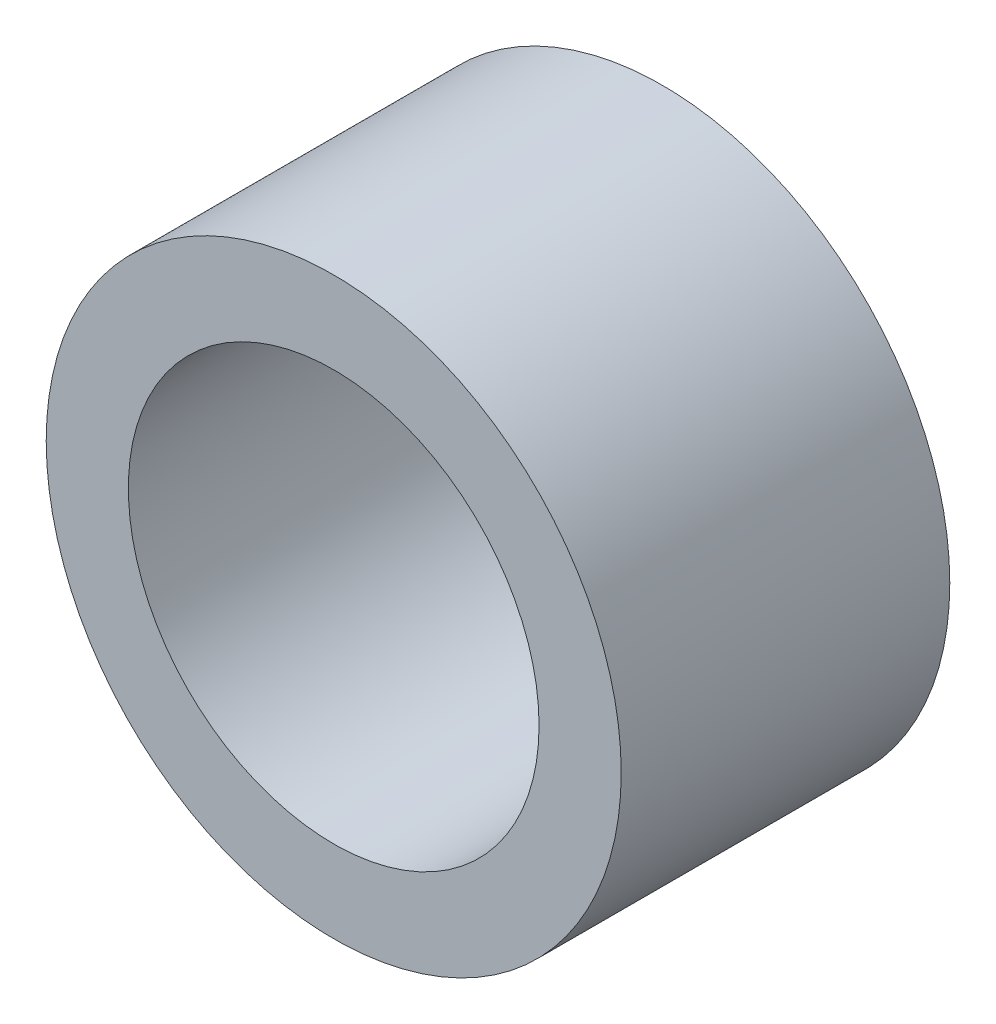
ISO-10303-21;
HEADER;
FILE_DESCRIPTION(('STEP AP214'),'2;1');
FILE_NAME('part.step','',(''),(''),'','','');
FILE_SCHEMA(('AUTOMOTIVE_DESIGN { 1 0 10303 214 1 1 1 1 }'));
ENDSEC;
DATA;
#1=APPLICATION_CONTEXT('core data for automotive mechanical design processes');
#2=APPLICATION_PROTOCOL_DEFINITION('international standard','automotive_design',2000,#1);
#3=PRODUCT_CONTEXT('',#1,'mechanical');
#4=PRODUCT('Part','Part','',(#3));
#5=PRODUCT_RELATED_PRODUCT_CATEGORY('part','',(#4));
#6=PRODUCT_DEFINITION_FORMATION('','',#4);
#7=PRODUCT_DEFINITION_CONTEXT('part definition',#1,'design');
#8=PRODUCT_DEFINITION('design','',#6,#7);
#9=PRODUCT_DEFINITION_SHAPE('','',#8);
#10=(LENGTH_UNIT() NAMED_UNIT(*) SI_UNIT(.MILLI.,.METRE.));
#11=(NAMED_UNIT(*) PLANE_ANGLE_UNIT() SI_UNIT($,.RADIAN.));
#12=(NAMED_UNIT(*) SI_UNIT($,.STERADIAN.) SOLID_ANGLE_UNIT());
#13=UNCERTAINTY_MEASURE_WITH_UNIT(LENGTH_MEASURE(1.E-05),#10,'distance_accuracy_value','');
#14=(GEOMETRIC_REPRESENTATION_CONTEXT(3) GLOBAL_UNCERTAINTY_ASSIGNED_CONTEXT((#13)) GLOBAL_UNIT_ASSIGNED_CONTEXT((#10,
#11,#12)) REPRESENTATION_CONTEXT('',''));
#15=CARTESIAN_POINT('',(0.,0.,0.));
#16=DIRECTION('',(0.,0.,1.));
#17=DIRECTION('',(1.,0.,0.));
#18=AXIS2_PLACEMENT_3D('',#15,#16,#17);
#19=CARTESIAN_POINT('',(0.,0.,4.));
#20=DIRECTION('',(0.,0.,1.));
#21=DIRECTION('',(1.,0.,0.));
#22=AXIS2_PLACEMENT_3D('',#19,#20,#21);
#23=PLANE('',#22);
#24=CARTESIAN_POINT('',(0.,0.,4.));
#25=DIRECTION('',(0.,0.,1.));
#26=DIRECTION('',(1.,0.,0.));
#27=AXIS2_PLACEMENT_3D('',#24,#25,#26);
#28=CIRCLE('',#27,3.5);
#29=CARTESIAN_POINT('',(3.5,0.,4.));
#30=VERTEX_POINT('',#29);
#31=EDGE_CURVE('E10',#30,#30,#28,.T.);
#32=ORIENTED_EDGE('',*,*,#31,.T.);
#33=EDGE_LOOP('',(#32));
#34=FACE_BOUND('',#33,.T.);
#35=CARTESIAN_POINT('',(0.,0.,4.));
#36=DIRECTION('',(0.,0.,1.));
#37=DIRECTION('',(1.,0.,0.));
#38=AXIS2_PLACEMENT_3D('',#35,#36,#37);
#39=CIRCLE('',#38,2.5);
#40=CARTESIAN_POINT('',(2.5,0.,4.));
#41=VERTEX_POINT('',#40);
#42=EDGE_CURVE('E56',#41,#41,#39,.T.);
#43=ORIENTED_EDGE('',*,*,#42,.F.);
#44=EDGE_LOOP('',(#43));
#45=FACE_BOUND('',#44,.T.);
#46=ADVANCED_FACE('F43',(#34,#45),#23,.T.);
#47=CARTESIAN_POINT('',(0.,0.,0.));
#48=DIRECTION('',(0.,0.,1.));
#49=DIRECTION('',(1.,0.,0.));
#50=AXIS2_PLACEMENT_3D('',#47,#48,#49);
#51=PLANE('',#50);
#52=CARTESIAN_POINT('',(0.,0.,0.));
#53=DIRECTION('',(0.,0.,1.));
#54=DIRECTION('',(1.,0.,0.));
#55=AXIS2_PLACEMENT_3D('',#52,#53,#54);
#56=CIRCLE('',#55,3.5);
#57=CARTESIAN_POINT('',(3.5,0.,0.));
#58=VERTEX_POINT('',#57);
#59=EDGE_CURVE('E47',#58,#58,#56,.T.);
#60=ORIENTED_EDGE('',*,*,#59,.F.);
#61=EDGE_LOOP('',(#60));
#62=FACE_BOUND('',#61,.T.);
#63=CARTESIAN_POINT('',(0.,0.,0.));
#64=DIRECTION('',(0.,0.,1.));
#65=DIRECTION('',(1.,0.,0.));
#66=AXIS2_PLACEMENT_3D('',#63,#64,#65);
#67=CIRCLE('',#66,2.5);
#68=CARTESIAN_POINT('',(2.5,0.,0.));
#69=VERTEX_POINT('',#68);
#70=EDGE_CURVE('E58',#69,#69,#67,.T.);
#71=ORIENTED_EDGE('',*,*,#70,.T.);
#72=EDGE_LOOP('',(#71));
#73=FACE_BOUND('',#72,.T.);
#74=ADVANCED_FACE('F70',(#62,#73),#51,.F.);
#75=CARTESIAN_POINT('',(0.,0.,4.));
#76=DIRECTION('',(0.,0.,-1.));
#77=DIRECTION('',(-1.,0.,0.));
#78=AXIS2_PLACEMENT_3D('',#75,#76,#77);
#79=CYLINDRICAL_SURFACE('',#78,3.5);
#80=ORIENTED_EDGE('',*,*,#31,.F.);
#81=EDGE_LOOP('',(#80));
#82=FACE_BOUND('',#81,.T.);
#83=ORIENTED_EDGE('',*,*,#59,.T.);
#84=EDGE_LOOP('',(#83));
#85=FACE_BOUND('',#84,.T.);
#86=ADVANCED_FACE('F45',(#82,#85),#79,.T.);
#87=CARTESIAN_POINT('',(0.,0.,4.));
#88=DIRECTION('',(0.,0.,-1.));
#89=DIRECTION('',(-1.,0.,0.));
#90=AXIS2_PLACEMENT_3D('',#87,#88,#89);
#91=CYLINDRICAL_SURFACE('',#90,2.5);
#92=ORIENTED_EDGE('',*,*,#42,.T.);
#93=EDGE_LOOP('',(#92));
#94=FACE_BOUND('',#93,.T.);
#95=ORIENTED_EDGE('',*,*,#70,.F.);
#96=EDGE_LOOP('',(#95));
#97=FACE_BOUND('',#96,.T.);
#98=ADVANCED_FACE('F66',(#94,#97),#91,.F.);
#99=CLOSED_SHELL('',(#46,#74,#86,#98));
#100=MANIFOLD_SOLID_BREP('B2',#99);
#101=ADVANCED_BREP_SHAPE_REPRESENTATION('',(#18,#100),#14);
#102=SHAPE_DEFINITION_REPRESENTATION(#9,#101);
ENDSEC;
END-ISO-10303-21;
